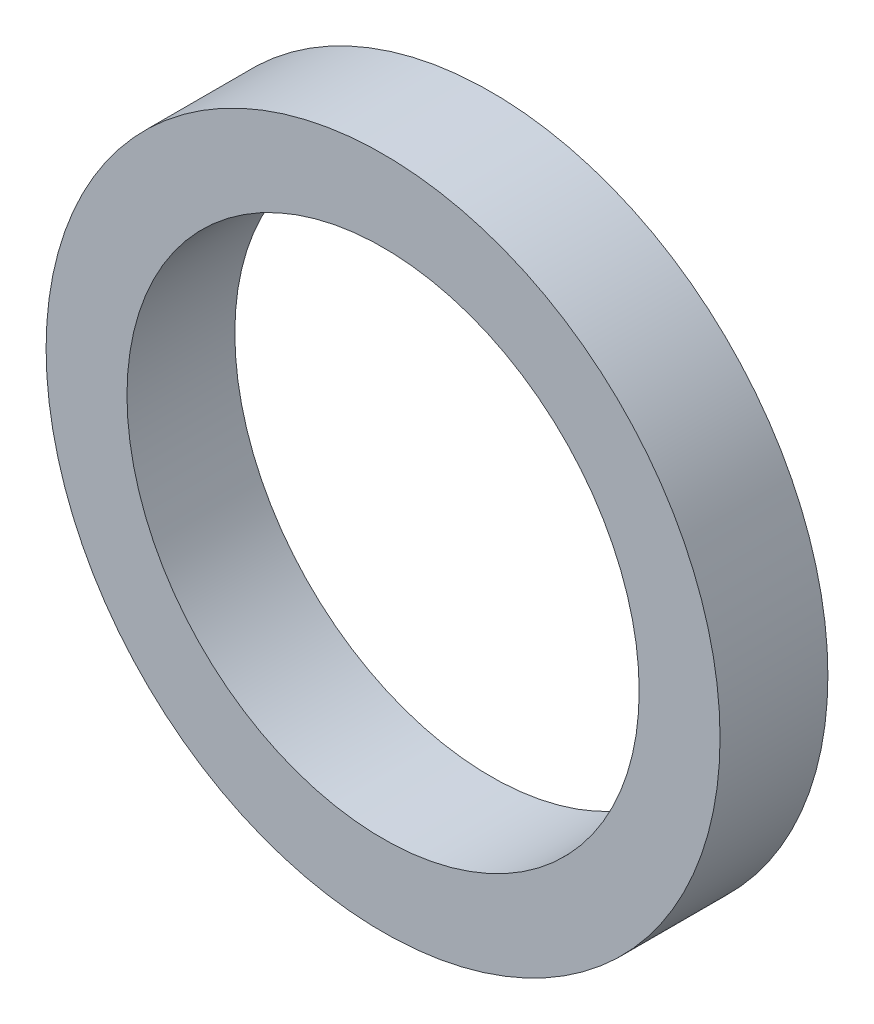
ISO-10303-21;
HEADER;
FILE_DESCRIPTION(('STEP AP214'),'2;1');
FILE_NAME('part.step','',(''),(''),'','','');
FILE_SCHEMA(('AUTOMOTIVE_DESIGN { 1 0 10303 214 1 1 1 1 }'));
ENDSEC;
DATA;
#1=APPLICATION_CONTEXT('core data for automotive mechanical design processes');
#2=APPLICATION_PROTOCOL_DEFINITION('international standard','automotive_design',2000,#1);
#3=PRODUCT_CONTEXT('',#1,'mechanical');
#4=PRODUCT('Part','Part','',(#3));
#5=PRODUCT_RELATED_PRODUCT_CATEGORY('part','',(#4));
#6=PRODUCT_DEFINITION_FORMATION('','',#4);
#7=PRODUCT_DEFINITION_CONTEXT('part definition',#1,'design');
#8=PRODUCT_DEFINITION('design','',#6,#7);
#9=PRODUCT_DEFINITION_SHAPE('','',#8);
#10=(LENGTH_UNIT() NAMED_UNIT(*) SI_UNIT(.MILLI.,.METRE.));
#11=(NAMED_UNIT(*) PLANE_ANGLE_UNIT() SI_UNIT($,.RADIAN.));
#12=(NAMED_UNIT(*) SI_UNIT($,.STERADIAN.) SOLID_ANGLE_UNIT());
#13=UNCERTAINTY_MEASURE_WITH_UNIT(LENGTH_MEASURE(1.E-05),#10,'distance_accuracy_value','');
#14=(GEOMETRIC_REPRESENTATION_CONTEXT(3) GLOBAL_UNCERTAINTY_ASSIGNED_CONTEXT((#13)) GLOBAL_UNIT_ASSIGNED_CONTEXT((#10,
#11,#12)) REPRESENTATION_CONTEXT('',''));
#15=CARTESIAN_POINT('',(0.,0.,0.));
#16=DIRECTION('',(0.,0.,1.));
#17=DIRECTION('',(1.,0.,0.));
#18=AXIS2_PLACEMENT_3D('',#15,#16,#17);
#19=CARTESIAN_POINT('',(0.,0.,8.));
#20=DIRECTION('',(0.,0.,1.));
#21=DIRECTION('',(1.,0.,0.));
#22=AXIS2_PLACEMENT_3D('',#19,#20,#21);
#23=PLANE('',#22);
#24=CARTESIAN_POINT('',(0.,0.,8.));
#25=DIRECTION('',(0.,0.,1.));
#26=DIRECTION('',(1.,0.,0.));
#27=AXIS2_PLACEMENT_3D('',#24,#25,#26);
#28=CIRCLE('',#27,25.);
#29=CARTESIAN_POINT('',(25.,0.,8.));
#30=VERTEX_POINT('',#29);
#31=EDGE_CURVE('E10',#30,#30,#28,.T.);
#32=ORIENTED_EDGE('',*,*,#31,.T.);
#33=EDGE_LOOP('',(#32));
#34=FACE_BOUND('',#33,.T.);
#35=CARTESIAN_POINT('',(0.,0.,8.));
#36=DIRECTION('',(0.,0.,1.));
#37=DIRECTION('',(1.,0.,0.));
#38=AXIS2_PLACEMENT_3D('',#35,#36,#37);
#39=CIRCLE('',#38,19.);
#40=CARTESIAN_POINT('',(19.,0.,8.));
#41=VERTEX_POINT('',#40);
#42=EDGE_CURVE('E56',#41,#41,#39,.T.);
#43=ORIENTED_EDGE('',*,*,#42,.F.);
#44=EDGE_LOOP('',(#43));
#45=FACE_BOUND('',#44,.T.);
#46=ADVANCED_FACE('F43',(#34,#45),#23,.T.);
#47=CARTESIAN_POINT('',(0.,0.,0.));
#48=DIRECTION('',(0.,0.,1.));
#49=DIRECTION('',(1.,0.,0.));
#50=AXIS2_PLACEMENT_3D('',#47,#48,#49);
#51=PLANE('',#50);
#52=CARTESIAN_POINT('',(0.,0.,0.));
#53=DIRECTION('',(0.,0.,1.));
#54=DIRECTION('',(1.,0.,0.));
#55=AXIS2_PLACEMENT_3D('',#52,#53,#54);
#56=CIRCLE('',#55,25.);
#57=CARTESIAN_POINT('',(25.,0.,0.));
#58=VERTEX_POINT('',#57);
#59=EDGE_CURVE('E47',#58,#58,#56,.T.);
#60=ORIENTED_EDGE('',*,*,#59,.F.);
#61=EDGE_LOOP('',(#60));
#62=FACE_BOUND('',#61,.T.);
#63=CARTESIAN_POINT('',(0.,0.,0.));
#64=DIRECTION('',(0.,0.,1.));
#65=DIRECTION('',(1.,0.,0.));
#66=AXIS2_PLACEMENT_3D('',#63,#64,#65);
#67=CIRCLE('',#66,19.);
#68=CARTESIAN_POINT('',(19.,0.,0.));
#69=VERTEX_POINT('',#68);
#70=EDGE_CURVE('E58',#69,#69,#67,.T.);
#71=ORIENTED_EDGE('',*,*,#70,.T.);
#72=EDGE_LOOP('',(#71));
#73=FACE_BOUND('',#72,.T.);
#74=ADVANCED_FACE('F70',(#62,#73),#51,.F.);
#75=CARTESIAN_POINT('',(0.,0.,8.));
#76=DIRECTION('',(0.,0.,-1.));
#77=DIRECTION('',(-1.,0.,0.));
#78=AXIS2_PLACEMENT_3D('',#75,#76,#77);
#79=CYLINDRICAL_SURFACE('',#78,25.);
#80=ORIENTED_EDGE('',*,*,#31,.F.);
#81=EDGE_LOOP('',(#80));
#82=FACE_BOUND('',#81,.T.);
#83=ORIENTED_EDGE('',*,*,#59,.T.);
#84=EDGE_LOOP('',(#83));
#85=FACE_BOUND('',#84,.T.);
#86=ADVANCED_FACE('F45',(#82,#85),#79,.T.);
#87=CARTESIAN_POINT('',(0.,0.,8.));
#88=DIRECTION('',(0.,0.,-1.));
#89=DIRECTION('',(-1.,0.,0.));
#90=AXIS2_PLACEMENT_3D('',#87,#88,#89);
#91=CYLINDRICAL_SURFACE('',#90,19.);
#92=ORIENTED_EDGE('',*,*,#42,.T.);
#93=EDGE_LOOP('',(#92));
#94=FACE_BOUND('',#93,.T.);
#95=ORIENTED_EDGE('',*,*,#70,.F.);
#96=EDGE_LOOP('',(#95));
#97=FACE_BOUND('',#96,.T.);
#98=ADVANCED_FACE('F66',(#94,#97),#91,.F.);
#99=CLOSED_SHELL('',(#46,#74,#86,#98));
#100=MANIFOLD_SOLID_BREP('B2',#99);
#101=ADVANCED_BREP_SHAPE_REPRESENTATION('',(#18,#100),#14);
#102=SHAPE_DEFINITION_REPRESENTATION(#9,#101);
ENDSEC;
END-ISO-10303-21;
